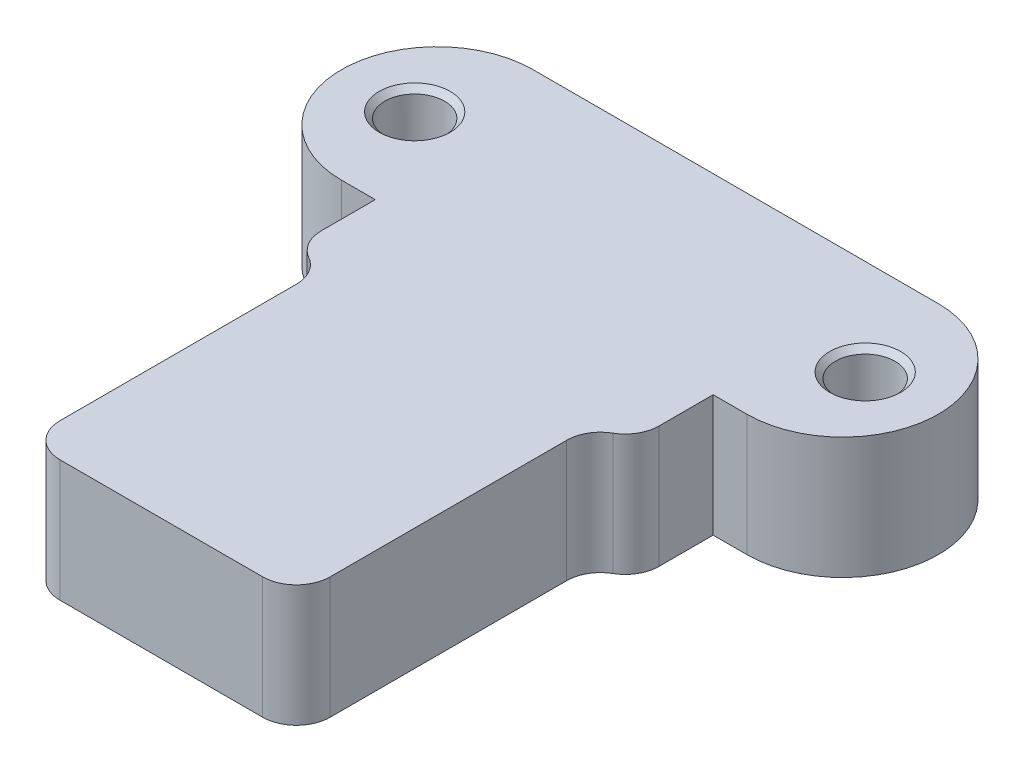
ISO-10303-21;
HEADER;
FILE_DESCRIPTION(('STEP AP214'),'2;1');
FILE_NAME('part.step','',(''),(''),'','','');
FILE_SCHEMA(('AUTOMOTIVE_DESIGN { 1 0 10303 214 1 1 1 1 }'));
ENDSEC;
DATA;
#1=APPLICATION_CONTEXT('core data for automotive mechanical design processes');
#2=APPLICATION_PROTOCOL_DEFINITION('international standard','automotive_design',2000,#1);
#3=PRODUCT_CONTEXT('',#1,'mechanical');
#4=PRODUCT('Part','Part','',(#3));
#5=PRODUCT_RELATED_PRODUCT_CATEGORY('part','',(#4));
#6=PRODUCT_DEFINITION_FORMATION('','',#4);
#7=PRODUCT_DEFINITION_CONTEXT('part definition',#1,'design');
#8=PRODUCT_DEFINITION('design','',#6,#7);
#9=PRODUCT_DEFINITION_SHAPE('','',#8);
#10=(LENGTH_UNIT() NAMED_UNIT(*) SI_UNIT(.MILLI.,.METRE.));
#11=(NAMED_UNIT(*) PLANE_ANGLE_UNIT() SI_UNIT($,.RADIAN.));
#12=(NAMED_UNIT(*) SI_UNIT($,.STERADIAN.) SOLID_ANGLE_UNIT());
#13=UNCERTAINTY_MEASURE_WITH_UNIT(LENGTH_MEASURE(1.E-05),#10,'distance_accuracy_value','');
#14=(GEOMETRIC_REPRESENTATION_CONTEXT(3) GLOBAL_UNCERTAINTY_ASSIGNED_CONTEXT((#13)) GLOBAL_UNIT_ASSIGNED_CONTEXT((#10,
#11,#12)) REPRESENTATION_CONTEXT('',''));
#15=CARTESIAN_POINT('',(0.,0.,0.));
#16=DIRECTION('',(0.,0.,1.));
#17=DIRECTION('',(1.,0.,0.));
#18=AXIS2_PLACEMENT_3D('',#15,#16,#17);
#19=CARTESIAN_POINT('',(-9.,5.4,0.));
#20=DIRECTION('',(0.,1.,0.));
#21=DIRECTION('',(0.,0.,1.));
#22=AXIS2_PLACEMENT_3D('',#19,#20,#21);
#23=PLANE('',#22);
#24=CARTESIAN_POINT('',(10.,5.4,-1.11022302462516E-13));
#25=DIRECTION('',(0.,1.,0.));
#26=DIRECTION('',(0.,0.,1.));
#27=AXIS2_PLACEMENT_3D('',#24,#25,#26);
#28=CIRCLE('',#27,1.57500000000002);
#29=CARTESIAN_POINT('',(10.,5.4,1.57499999999991));
#30=VERTEX_POINT('',#29);
#31=EDGE_CURVE('E198',#30,#30,#28,.F.);
#32=ORIENTED_EDGE('',*,*,#31,.T.);
#33=EDGE_LOOP('',(#32));
#34=FACE_BOUND('',#33,.T.);
#35=CARTESIAN_POINT('',(-10.,5.4,0.));
#36=DIRECTION('',(0.,1.,0.));
#37=DIRECTION('',(0.,0.,1.));
#38=AXIS2_PLACEMENT_3D('',#35,#36,#37);
#39=CIRCLE('',#38,1.57500000000002);
#40=CARTESIAN_POINT('',(-10.,5.4,1.57500000000002));
#41=VERTEX_POINT('',#40);
#42=EDGE_CURVE('E195',#41,#41,#39,.F.);
#43=ORIENTED_EDGE('',*,*,#42,.T.);
#44=EDGE_LOOP('',(#43));
#45=FACE_BOUND('',#44,.T.);
#46=DIRECTION('',(0.,0.,1.));
#47=VECTOR('',#46,1.);
#48=CARTESIAN_POINT('',(-7.50000000000004,5.4,4.25));
#49=LINE('',#48,#47);
#50=CARTESIAN_POINT('',(-7.50000000000004,5.4,4.25));
#51=VERTEX_POINT('',#50);
#52=CARTESIAN_POINT('',(-7.50000000000004,5.4,6.65192378864666));
#53=VERTEX_POINT('',#52);
#54=EDGE_CURVE('E164',#51,#53,#49,.T.);
#55=ORIENTED_EDGE('',*,*,#54,.T.);
#56=CARTESIAN_POINT('',(-6.00000000000004,5.4,6.65192378864666));
#57=DIRECTION('',(0.,1.,0.));
#58=DIRECTION('',(0.,0.,1.));
#59=AXIS2_PLACEMENT_3D('',#56,#57,#58);
#60=CIRCLE('',#59,1.5);
#61=CARTESIAN_POINT('',(-6.75000000000002,5.4,7.95096189432333));
#62=VERTEX_POINT('',#61);
#63=EDGE_CURVE('E249',#53,#62,#60,.T.);
#64=ORIENTED_EDGE('',*,*,#63,.T.);
#65=CARTESIAN_POINT('',(-7.5,5.4,9.25));
#66=DIRECTION('',(0.,1.,0.));
#67=DIRECTION('',(0.,0.,1.));
#68=AXIS2_PLACEMENT_3D('',#65,#66,#67);
#69=CIRCLE('',#68,1.5);
#70=CARTESIAN_POINT('',(-6.,5.4,9.25));
#71=VERTEX_POINT('',#70);
#72=EDGE_CURVE('E233',#62,#71,#69,.F.);
#73=ORIENTED_EDGE('',*,*,#72,.T.);
#74=DIRECTION('',(0.,0.,1.));
#75=VECTOR('',#74,1.);
#76=CARTESIAN_POINT('',(-6.,5.4,7.75));
#77=LINE('',#76,#75);
#78=CARTESIAN_POINT('',(-6.,5.4,19.75));
#79=VERTEX_POINT('',#78);
#80=EDGE_CURVE('E324',#71,#79,#77,.T.);
#81=ORIENTED_EDGE('',*,*,#80,.T.);
#82=CARTESIAN_POINT('',(-4.5,5.4,19.75));
#83=DIRECTION('',(0.,1.,0.));
#84=DIRECTION('',(0.,0.,1.));
#85=AXIS2_PLACEMENT_3D('',#82,#83,#84);
#86=CIRCLE('',#85,1.5);
#87=CARTESIAN_POINT('',(-4.5,5.4,21.25));
#88=VERTEX_POINT('',#87);
#89=EDGE_CURVE('E228',#79,#88,#86,.T.);
#90=ORIENTED_EDGE('',*,*,#89,.T.);
#91=DIRECTION('',(1.,0.,0.));
#92=VECTOR('',#91,1.);
#93=CARTESIAN_POINT('',(-6.,5.4,21.25));
#94=LINE('',#93,#92);
#95=CARTESIAN_POINT('',(4.50000000000013,5.4,21.25));
#96=VERTEX_POINT('',#95);
#97=EDGE_CURVE('E319',#88,#96,#94,.T.);
#98=ORIENTED_EDGE('',*,*,#97,.T.);
#99=CARTESIAN_POINT('',(4.50000000000013,5.4,19.75));
#100=DIRECTION('',(0.,1.,0.));
#101=DIRECTION('',(0.,0.,1.));
#102=AXIS2_PLACEMENT_3D('',#99,#100,#101);
#103=CIRCLE('',#102,1.5);
#104=CARTESIAN_POINT('',(6.00000000000013,5.4,19.75));
#105=VERTEX_POINT('',#104);
#106=EDGE_CURVE('E226',#96,#105,#103,.T.);
#107=ORIENTED_EDGE('',*,*,#106,.T.);
#108=DIRECTION('',(0.,0.,-1.));
#109=VECTOR('',#108,1.);
#110=CARTESIAN_POINT('',(6.00000000000005,5.4,7.75));
#111=LINE('',#110,#109);
#112=CARTESIAN_POINT('',(6.00000000000006,5.4,9.25000000000001));
#113=VERTEX_POINT('',#112);
#114=EDGE_CURVE('E292',#105,#113,#111,.T.);
#115=ORIENTED_EDGE('',*,*,#114,.T.);
#116=CARTESIAN_POINT('',(7.50000000000006,5.4,9.25));
#117=DIRECTION('',(0.,1.,0.));
#118=DIRECTION('',(0.,0.,1.));
#119=AXIS2_PLACEMENT_3D('',#116,#117,#118);
#120=CIRCLE('',#119,1.5);
#121=CARTESIAN_POINT('',(6.75000000000007,5.4,7.95096189432333));
#122=VERTEX_POINT('',#121);
#123=EDGE_CURVE('E237',#113,#122,#120,.F.);
#124=ORIENTED_EDGE('',*,*,#123,.T.);
#125=CARTESIAN_POINT('',(6.00000000000009,5.4,6.65192378864667));
#126=DIRECTION('',(0.,1.,0.));
#127=DIRECTION('',(0.,0.,1.));
#128=AXIS2_PLACEMENT_3D('',#125,#126,#127);
#129=CIRCLE('',#128,1.5);
#130=CARTESIAN_POINT('',(7.50000000000009,5.4,6.65192378864666));
#131=VERTEX_POINT('',#130);
#132=EDGE_CURVE('E56',#122,#131,#129,.T.);
#133=ORIENTED_EDGE('',*,*,#132,.T.);
#134=DIRECTION('',(0.,0.,-1.));
#135=VECTOR('',#134,1.);
#136=CARTESIAN_POINT('',(7.50000000000007,5.4,4.25));
#137=LINE('',#136,#135);
#138=CARTESIAN_POINT('',(7.50000000000007,5.4,4.25));
#139=VERTEX_POINT('',#138);
#140=EDGE_CURVE('E258',#131,#139,#137,.T.);
#141=ORIENTED_EDGE('',*,*,#140,.T.);
#142=DIRECTION('',(1.,0.,0.));
#143=VECTOR('',#142,1.);
#144=CARTESIAN_POINT('',(9.00000000000003,5.4,4.24999999999989));
#145=LINE('',#144,#143);
#146=CARTESIAN_POINT('',(9.00000000000003,5.4,4.24999999999989));
#147=VERTEX_POINT('',#146);
#148=EDGE_CURVE('E287',#139,#147,#145,.T.);
#149=ORIENTED_EDGE('',*,*,#148,.T.);
#150=CARTESIAN_POINT('',(9.,5.4,-1.11022302462516E-13));
#151=DIRECTION('',(0.,1.,0.));
#152=DIRECTION('',(0.,0.,-1.));
#153=AXIS2_PLACEMENT_3D('',#150,#151,#152);
#154=CIRCLE('',#153,4.25);
#155=CARTESIAN_POINT('',(8.99999999999997,5.4,-4.25000000000011));
#156=VERTEX_POINT('',#155);
#157=EDGE_CURVE('E289',#147,#156,#154,.T.);
#158=ORIENTED_EDGE('',*,*,#157,.T.);
#159=DIRECTION('',(-1.,0.,0.));
#160=VECTOR('',#159,1.);
#161=CARTESIAN_POINT('',(-9.,5.4,-4.25));
#162=LINE('',#161,#160);
#163=CARTESIAN_POINT('',(-9.,5.4,-4.25));
#164=VERTEX_POINT('',#163);
#165=EDGE_CURVE('E169',#156,#164,#162,.T.);
#166=ORIENTED_EDGE('',*,*,#165,.T.);
#167=CARTESIAN_POINT('',(-9.,5.4,0.));
#168=DIRECTION('',(0.,1.,0.));
#169=DIRECTION('',(0.,0.,1.));
#170=AXIS2_PLACEMENT_3D('',#167,#168,#169);
#171=CIRCLE('',#170,4.25);
#172=CARTESIAN_POINT('',(-9.,5.4,4.25));
#173=VERTEX_POINT('',#172);
#174=EDGE_CURVE('E165',#164,#173,#171,.T.);
#175=ORIENTED_EDGE('',*,*,#174,.T.);
#176=DIRECTION('',(1.,0.,0.));
#177=VECTOR('',#176,1.);
#178=CARTESIAN_POINT('',(-9.,5.4,4.25));
#179=LINE('',#178,#177);
#180=EDGE_CURVE('E154',#173,#51,#179,.T.);
#181=ORIENTED_EDGE('',*,*,#180,.T.);
#182=EDGE_LOOP('',(#55,#64,#73,#81,#90,#98,#107,#115,#124,#133,#141,#149,#158,#166,#175,#181));
#183=FACE_BOUND('',#182,.T.);
#184=ADVANCED_FACE('F41',(#34,#45,#183),#23,.T.);
#185=CARTESIAN_POINT('',(-9.,0.,0.));
#186=DIRECTION('',(0.,1.,0.));
#187=DIRECTION('',(0.,0.,1.));
#188=AXIS2_PLACEMENT_3D('',#185,#186,#187);
#189=PLANE('',#188);
#190=CARTESIAN_POINT('',(10.,0.,-1.11022302462516E-13));
#191=DIRECTION('',(0.,1.,0.));
#192=DIRECTION('',(0.,0.,1.));
#193=AXIS2_PLACEMENT_3D('',#190,#191,#192);
#194=CIRCLE('',#193,1.57499999999999);
#195=CARTESIAN_POINT('',(10.,0.,1.57499999999988));
#196=VERTEX_POINT('',#195);
#197=EDGE_CURVE('E181',#196,#196,#194,.T.);
#198=ORIENTED_EDGE('',*,*,#197,.T.);
#199=EDGE_LOOP('',(#198));
#200=FACE_BOUND('',#199,.T.);
#201=CARTESIAN_POINT('',(-10.,0.,0.));
#202=DIRECTION('',(0.,1.,0.));
#203=DIRECTION('',(0.,0.,1.));
#204=AXIS2_PLACEMENT_3D('',#201,#202,#203);
#205=CIRCLE('',#204,1.57499999999998);
#206=CARTESIAN_POINT('',(-10.,0.,1.57499999999998));
#207=VERTEX_POINT('',#206);
#208=EDGE_CURVE('E178',#207,#207,#205,.T.);
#209=ORIENTED_EDGE('',*,*,#208,.T.);
#210=EDGE_LOOP('',(#209));
#211=FACE_BOUND('',#210,.T.);
#212=CARTESIAN_POINT('',(-7.5,0.,9.25));
#213=DIRECTION('',(0.,1.,0.));
#214=DIRECTION('',(0.,0.,1.));
#215=AXIS2_PLACEMENT_3D('',#212,#213,#214);
#216=CIRCLE('',#215,1.5);
#217=CARTESIAN_POINT('',(-6.,0.,9.25));
#218=VERTEX_POINT('',#217);
#219=CARTESIAN_POINT('',(-6.75000000000002,0.,7.95096189432333));
#220=VERTEX_POINT('',#219);
#221=EDGE_CURVE('E230',#218,#220,#216,.T.);
#222=ORIENTED_EDGE('',*,*,#221,.T.);
#223=CARTESIAN_POINT('',(-6.00000000000004,0.,6.65192378864666));
#224=DIRECTION('',(0.,1.,0.));
#225=DIRECTION('',(0.,0.,1.));
#226=AXIS2_PLACEMENT_3D('',#223,#224,#225);
#227=CIRCLE('',#226,1.5);
#228=CARTESIAN_POINT('',(-7.50000000000004,0.,6.65192378864666));
#229=VERTEX_POINT('',#228);
#230=EDGE_CURVE('E244',#220,#229,#227,.F.);
#231=ORIENTED_EDGE('',*,*,#230,.T.);
#232=DIRECTION('',(0.,0.,1.));
#233=VECTOR('',#232,1.);
#234=CARTESIAN_POINT('',(-7.50000000000004,0.,4.25));
#235=LINE('',#234,#233);
#236=CARTESIAN_POINT('',(-7.50000000000004,0.,4.25));
#237=VERTEX_POINT('',#236);
#238=EDGE_CURVE('E300',#237,#229,#235,.T.);
#239=ORIENTED_EDGE('',*,*,#238,.F.);
#240=DIRECTION('',(1.,0.,0.));
#241=VECTOR('',#240,1.);
#242=CARTESIAN_POINT('',(-9.,0.,4.25));
#243=LINE('',#242,#241);
#244=CARTESIAN_POINT('',(-9.,0.,4.25));
#245=VERTEX_POINT('',#244);
#246=EDGE_CURVE('E298',#245,#237,#243,.T.);
#247=ORIENTED_EDGE('',*,*,#246,.F.);
#248=CARTESIAN_POINT('',(-9.,0.,0.));
#249=DIRECTION('',(0.,1.,0.));
#250=DIRECTION('',(0.,0.,1.));
#251=AXIS2_PLACEMENT_3D('',#248,#249,#250);
#252=CIRCLE('',#251,4.25);
#253=CARTESIAN_POINT('',(-9.,0.,-4.25));
#254=VERTEX_POINT('',#253);
#255=EDGE_CURVE('E177',#254,#245,#252,.T.);
#256=ORIENTED_EDGE('',*,*,#255,.F.);
#257=DIRECTION('',(-1.,0.,0.));
#258=VECTOR('',#257,1.);
#259=CARTESIAN_POINT('',(-9.,0.,-4.25));
#260=LINE('',#259,#258);
#261=CARTESIAN_POINT('',(8.99999999999997,0.,-4.25000000000011));
#262=VERTEX_POINT('',#261);
#263=EDGE_CURVE('E173',#262,#254,#260,.T.);
#264=ORIENTED_EDGE('',*,*,#263,.F.);
#265=CARTESIAN_POINT('',(9.,0.,-1.11022302462516E-13));
#266=DIRECTION('',(0.,1.,0.));
#267=DIRECTION('',(0.,0.,-1.));
#268=AXIS2_PLACEMENT_3D('',#265,#266,#267);
#269=CIRCLE('',#268,4.25);
#270=CARTESIAN_POINT('',(9.00000000000003,0.,4.24999999999989));
#271=VERTEX_POINT('',#270);
#272=EDGE_CURVE('E267',#271,#262,#269,.T.);
#273=ORIENTED_EDGE('',*,*,#272,.F.);
#274=DIRECTION('',(1.,0.,0.));
#275=VECTOR('',#274,1.);
#276=CARTESIAN_POINT('',(9.00000000000003,0.,4.24999999999989));
#277=LINE('',#276,#275);
#278=CARTESIAN_POINT('',(7.50000000000007,0.,4.25));
#279=VERTEX_POINT('',#278);
#280=EDGE_CURVE('E264',#279,#271,#277,.T.);
#281=ORIENTED_EDGE('',*,*,#280,.F.);
#282=DIRECTION('',(0.,0.,-1.));
#283=VECTOR('',#282,1.);
#284=CARTESIAN_POINT('',(7.50000000000007,0.,4.25));
#285=LINE('',#284,#283);
#286=CARTESIAN_POINT('',(7.50000000000009,0.,6.65192378864666));
#287=VERTEX_POINT('',#286);
#288=EDGE_CURVE('E256',#287,#279,#285,.T.);
#289=ORIENTED_EDGE('',*,*,#288,.F.);
#290=CARTESIAN_POINT('',(6.00000000000009,0.,6.65192378864667));
#291=DIRECTION('',(0.,1.,0.));
#292=DIRECTION('',(0.,0.,1.));
#293=AXIS2_PLACEMENT_3D('',#290,#291,#292);
#294=CIRCLE('',#293,1.5);
#295=CARTESIAN_POINT('',(6.75000000000007,0.,7.95096189432333));
#296=VERTEX_POINT('',#295);
#297=EDGE_CURVE('E242',#287,#296,#294,.F.);
#298=ORIENTED_EDGE('',*,*,#297,.T.);
#299=CARTESIAN_POINT('',(7.50000000000006,0.,9.25));
#300=DIRECTION('',(0.,1.,0.));
#301=DIRECTION('',(0.,0.,1.));
#302=AXIS2_PLACEMENT_3D('',#299,#300,#301);
#303=CIRCLE('',#302,1.5);
#304=CARTESIAN_POINT('',(6.00000000000006,0.,9.25000000000001));
#305=VERTEX_POINT('',#304);
#306=EDGE_CURVE('E235',#296,#305,#303,.T.);
#307=ORIENTED_EDGE('',*,*,#306,.T.);
#308=DIRECTION('',(0.,0.,-1.));
#309=VECTOR('',#308,1.);
#310=CARTESIAN_POINT('',(6.00000000000005,0.,7.75));
#311=LINE('',#310,#309);
#312=CARTESIAN_POINT('',(6.00000000000013,0.,19.75));
#313=VERTEX_POINT('',#312);
#314=EDGE_CURVE('E265',#313,#305,#311,.T.);
#315=ORIENTED_EDGE('',*,*,#314,.F.);
#316=CARTESIAN_POINT('',(4.50000000000013,0.,19.75));
#317=DIRECTION('',(0.,1.,0.));
#318=DIRECTION('',(0.,0.,1.));
#319=AXIS2_PLACEMENT_3D('',#316,#317,#318);
#320=CIRCLE('',#319,1.5);
#321=CARTESIAN_POINT('',(4.50000000000013,0.,21.25));
#322=VERTEX_POINT('',#321);
#323=EDGE_CURVE('E222',#313,#322,#320,.F.);
#324=ORIENTED_EDGE('',*,*,#323,.T.);
#325=DIRECTION('',(1.,0.,0.));
#326=VECTOR('',#325,1.);
#327=CARTESIAN_POINT('',(-6.,0.,21.25));
#328=LINE('',#327,#326);
#329=CARTESIAN_POINT('',(-4.5,0.,21.25));
#330=VERTEX_POINT('',#329);
#331=EDGE_CURVE('E270',#330,#322,#328,.T.);
#332=ORIENTED_EDGE('',*,*,#331,.F.);
#333=CARTESIAN_POINT('',(-4.5,0.,19.75));
#334=DIRECTION('',(0.,1.,0.));
#335=DIRECTION('',(0.,0.,1.));
#336=AXIS2_PLACEMENT_3D('',#333,#334,#335);
#337=CIRCLE('',#336,1.5);
#338=CARTESIAN_POINT('',(-6.,0.,19.75));
#339=VERTEX_POINT('',#338);
#340=EDGE_CURVE('E224',#330,#339,#337,.F.);
#341=ORIENTED_EDGE('',*,*,#340,.T.);
#342=DIRECTION('',(0.,0.,1.));
#343=VECTOR('',#342,1.);
#344=CARTESIAN_POINT('',(-6.,0.,7.75));
#345=LINE('',#344,#343);
#346=EDGE_CURVE('E303',#218,#339,#345,.T.);
#347=ORIENTED_EDGE('',*,*,#346,.F.);
#348=EDGE_LOOP('',(#222,#231,#239,#247,#256,#264,#273,#281,#289,#298,#307,#315,#324,#332,#341,#347));
#349=FACE_BOUND('',#348,.T.);
#350=ADVANCED_FACE('F262',(#200,#211,#349),#189,.F.);
#351=CARTESIAN_POINT('',(-9.,5.4,0.));
#352=DIRECTION('',(0.,-1.,0.));
#353=DIRECTION('',(0.,0.,-1.));
#354=AXIS2_PLACEMENT_3D('',#351,#352,#353);
#355=CYLINDRICAL_SURFACE('',#354,4.25);
#356=ORIENTED_EDGE('',*,*,#255,.T.);
#357=DIRECTION('',(0.,-1.,0.));
#358=VECTOR('',#357,1.);
#359=CARTESIAN_POINT('',(-9.,5.4,4.25));
#360=LINE('',#359,#358);
#361=EDGE_CURVE('E158',#173,#245,#360,.T.);
#362=ORIENTED_EDGE('',*,*,#361,.F.);
#363=ORIENTED_EDGE('',*,*,#174,.F.);
#364=DIRECTION('',(0.,-1.,0.));
#365=VECTOR('',#364,1.);
#366=CARTESIAN_POINT('',(-9.,5.4,-4.25));
#367=LINE('',#366,#365);
#368=EDGE_CURVE('E276',#164,#254,#367,.T.);
#369=ORIENTED_EDGE('',*,*,#368,.T.);
#370=EDGE_LOOP('',(#356,#362,#363,#369));
#371=FACE_BOUND('',#370,.T.);
#372=ADVANCED_FACE('F175',(#371),#355,.T.);
#373=CARTESIAN_POINT('',(-9.,5.4,4.25));
#374=DIRECTION('',(0.,0.,-1.));
#375=DIRECTION('',(-1.,0.,0.));
#376=AXIS2_PLACEMENT_3D('',#373,#374,#375);
#377=PLANE('',#376);
#378=ORIENTED_EDGE('',*,*,#246,.T.);
#379=DIRECTION('',(0.,-1.,0.));
#380=VECTOR('',#379,1.);
#381=CARTESIAN_POINT('',(-7.50000000000004,5.4,4.25));
#382=LINE('',#381,#380);
#383=EDGE_CURVE('E161',#51,#237,#382,.T.);
#384=ORIENTED_EDGE('',*,*,#383,.F.);
#385=ORIENTED_EDGE('',*,*,#180,.F.);
#386=ORIENTED_EDGE('',*,*,#361,.T.);
#387=EDGE_LOOP('',(#378,#384,#385,#386));
#388=FACE_BOUND('',#387,.T.);
#389=ADVANCED_FACE('F156',(#388),#377,.F.);
#390=CARTESIAN_POINT('',(-7.50000000000004,5.4,4.25));
#391=DIRECTION('',(1.,0.,0.));
#392=DIRECTION('',(0.,0.,-1.));
#393=AXIS2_PLACEMENT_3D('',#390,#391,#392);
#394=PLANE('',#393);
#395=ORIENTED_EDGE('',*,*,#238,.T.);
#396=DIRECTION('',(0.,1.,0.));
#397=VECTOR('',#396,1.);
#398=CARTESIAN_POINT('',(-7.50000000000004,5.4,6.65192378864666));
#399=LINE('',#398,#397);
#400=EDGE_CURVE('E246',#229,#53,#399,.T.);
#401=ORIENTED_EDGE('',*,*,#400,.T.);
#402=ORIENTED_EDGE('',*,*,#54,.F.);
#403=ORIENTED_EDGE('',*,*,#383,.T.);
#404=EDGE_LOOP('',(#395,#401,#402,#403));
#405=FACE_BOUND('',#404,.T.);
#406=ADVANCED_FACE('F388',(#405),#394,.F.);
#407=CARTESIAN_POINT('',(-6.,5.4,7.75));
#408=DIRECTION('',(1.,0.,0.));
#409=DIRECTION('',(0.,0.,-1.));
#410=AXIS2_PLACEMENT_3D('',#407,#408,#409);
#411=PLANE('',#410);
#412=ORIENTED_EDGE('',*,*,#80,.F.);
#413=DIRECTION('',(0.,-1.,0.));
#414=VECTOR('',#413,1.);
#415=CARTESIAN_POINT('',(-6.,0.,9.25));
#416=LINE('',#415,#414);
#417=EDGE_CURVE('E209',#71,#218,#416,.T.);
#418=ORIENTED_EDGE('',*,*,#417,.T.);
#419=ORIENTED_EDGE('',*,*,#346,.T.);
#420=DIRECTION('',(0.,-1.,0.));
#421=VECTOR('',#420,1.);
#422=CARTESIAN_POINT('',(-6.,5.4,19.75));
#423=LINE('',#422,#421);
#424=EDGE_CURVE('E207',#339,#79,#423,.F.);
#425=ORIENTED_EDGE('',*,*,#424,.T.);
#426=EDGE_LOOP('',(#412,#418,#419,#425));
#427=FACE_BOUND('',#426,.T.);
#428=ADVANCED_FACE('F344',(#427),#411,.F.);
#429=CARTESIAN_POINT('',(-6.,5.4,21.25));
#430=DIRECTION('',(0.,0.,-1.));
#431=DIRECTION('',(-1.,0.,0.));
#432=AXIS2_PLACEMENT_3D('',#429,#430,#431);
#433=PLANE('',#432);
#434=ORIENTED_EDGE('',*,*,#97,.F.);
#435=DIRECTION('',(0.,-1.,0.));
#436=VECTOR('',#435,1.);
#437=CARTESIAN_POINT('',(-4.5,5.4,21.25));
#438=LINE('',#437,#436);
#439=EDGE_CURVE('E219',#88,#330,#438,.T.);
#440=ORIENTED_EDGE('',*,*,#439,.T.);
#441=ORIENTED_EDGE('',*,*,#331,.T.);
#442=DIRECTION('',(0.,-1.,0.));
#443=VECTOR('',#442,1.);
#444=CARTESIAN_POINT('',(4.50000000000013,5.4,21.25));
#445=LINE('',#444,#443);
#446=EDGE_CURVE('E217',#322,#96,#445,.F.);
#447=ORIENTED_EDGE('',*,*,#446,.T.);
#448=EDGE_LOOP('',(#434,#440,#441,#447));
#449=FACE_BOUND('',#448,.T.);
#450=ADVANCED_FACE('F310',(#449),#433,.F.);
#451=CARTESIAN_POINT('',(6.00000000000005,5.4,7.75));
#452=DIRECTION('',(-1.,0.,0.));
#453=DIRECTION('',(0.,0.,1.));
#454=AXIS2_PLACEMENT_3D('',#451,#452,#453);
#455=PLANE('',#454);
#456=ORIENTED_EDGE('',*,*,#314,.T.);
#457=DIRECTION('',(0.,-1.,0.));
#458=VECTOR('',#457,1.);
#459=CARTESIAN_POINT('',(6.00000000000006,5.4,9.25000000000001));
#460=LINE('',#459,#458);
#461=EDGE_CURVE('E215',#305,#113,#460,.F.);
#462=ORIENTED_EDGE('',*,*,#461,.T.);
#463=ORIENTED_EDGE('',*,*,#114,.F.);
#464=DIRECTION('',(0.,-1.,0.));
#465=VECTOR('',#464,1.);
#466=CARTESIAN_POINT('',(6.00000000000013,5.4,19.75));
#467=LINE('',#466,#465);
#468=EDGE_CURVE('E212',#105,#313,#467,.T.);
#469=ORIENTED_EDGE('',*,*,#468,.T.);
#470=EDGE_LOOP('',(#456,#462,#463,#469));
#471=FACE_BOUND('',#470,.T.);
#472=ADVANCED_FACE('F321',(#471),#455,.F.);
#473=CARTESIAN_POINT('',(7.50000000000007,5.4,4.25));
#474=DIRECTION('',(-1.,0.,0.));
#475=DIRECTION('',(0.,0.,1.));
#476=AXIS2_PLACEMENT_3D('',#473,#474,#475);
#477=PLANE('',#476);
#478=ORIENTED_EDGE('',*,*,#140,.F.);
#479=DIRECTION('',(0.,1.,0.));
#480=VECTOR('',#479,1.);
#481=CARTESIAN_POINT('',(7.50000000000009,5.4,6.65192378864666));
#482=LINE('',#481,#480);
#483=EDGE_CURVE('E49',#131,#287,#482,.F.);
#484=ORIENTED_EDGE('',*,*,#483,.T.);
#485=ORIENTED_EDGE('',*,*,#288,.T.);
#486=DIRECTION('',(0.,-1.,0.));
#487=VECTOR('',#486,1.);
#488=CARTESIAN_POINT('',(7.50000000000007,5.4,4.25));
#489=LINE('',#488,#487);
#490=EDGE_CURVE('E183',#139,#279,#489,.T.);
#491=ORIENTED_EDGE('',*,*,#490,.F.);
#492=EDGE_LOOP('',(#478,#484,#485,#491));
#493=FACE_BOUND('',#492,.T.);
#494=ADVANCED_FACE('F254',(#493),#477,.F.);
#495=CARTESIAN_POINT('',(9.00000000000003,5.4,4.24999999999989));
#496=DIRECTION('',(0.,0.,-1.));
#497=DIRECTION('',(-1.,0.,0.));
#498=AXIS2_PLACEMENT_3D('',#495,#496,#497);
#499=PLANE('',#498);
#500=ORIENTED_EDGE('',*,*,#280,.T.);
#501=DIRECTION('',(0.,-1.,0.));
#502=VECTOR('',#501,1.);
#503=CARTESIAN_POINT('',(9.00000000000003,5.4,4.24999999999989));
#504=LINE('',#503,#502);
#505=EDGE_CURVE('E281',#147,#271,#504,.T.);
#506=ORIENTED_EDGE('',*,*,#505,.F.);
#507=ORIENTED_EDGE('',*,*,#148,.F.);
#508=ORIENTED_EDGE('',*,*,#490,.T.);
#509=EDGE_LOOP('',(#500,#506,#507,#508));
#510=FACE_BOUND('',#509,.T.);
#511=ADVANCED_FACE('F285',(#510),#499,.F.);
#512=CARTESIAN_POINT('',(9.,5.4,-1.11022302462516E-13));
#513=DIRECTION('',(0.,-1.,0.));
#514=DIRECTION('',(0.,0.,-1.));
#515=AXIS2_PLACEMENT_3D('',#512,#513,#514);
#516=CYLINDRICAL_SURFACE('',#515,4.25);
#517=ORIENTED_EDGE('',*,*,#272,.T.);
#518=DIRECTION('',(0.,-1.,0.));
#519=VECTOR('',#518,1.);
#520=CARTESIAN_POINT('',(8.99999999999997,5.4,-4.25000000000011));
#521=LINE('',#520,#519);
#522=EDGE_CURVE('E278',#156,#262,#521,.T.);
#523=ORIENTED_EDGE('',*,*,#522,.F.);
#524=ORIENTED_EDGE('',*,*,#157,.F.);
#525=ORIENTED_EDGE('',*,*,#505,.T.);
#526=EDGE_LOOP('',(#517,#523,#524,#525));
#527=FACE_BOUND('',#526,.T.);
#528=ADVANCED_FACE('F374',(#527),#516,.T.);
#529=CARTESIAN_POINT('',(-9.,5.4,-4.25));
#530=DIRECTION('',(0.,0.,1.));
#531=DIRECTION('',(1.,0.,0.));
#532=AXIS2_PLACEMENT_3D('',#529,#530,#531);
#533=PLANE('',#532);
#534=ORIENTED_EDGE('',*,*,#263,.T.);
#535=ORIENTED_EDGE('',*,*,#368,.F.);
#536=ORIENTED_EDGE('',*,*,#165,.F.);
#537=ORIENTED_EDGE('',*,*,#522,.T.);
#538=EDGE_LOOP('',(#534,#535,#536,#537));
#539=FACE_BOUND('',#538,.T.);
#540=ADVANCED_FACE('F371',(#539),#533,.F.);
#541=CARTESIAN_POINT('',(-10.,5.4,0.));
#542=DIRECTION('',(0.,-1.,0.));
#543=DIRECTION('',(0.,0.,-1.));
#544=AXIS2_PLACEMENT_3D('',#541,#542,#543);
#545=CYLINDRICAL_SURFACE('',#544,1.325);
#546=CARTESIAN_POINT('',(-10.,0.249999999999984,0.));
#547=DIRECTION('',(0.,1.,0.));
#548=DIRECTION('',(0.,0.,1.));
#549=AXIS2_PLACEMENT_3D('',#546,#547,#548);
#550=CIRCLE('',#549,1.325);
#551=CARTESIAN_POINT('',(-10.,0.249999999999984,-1.325));
#552=VERTEX_POINT('',#551);
#553=EDGE_CURVE('E204',#552,#552,#550,.F.);
#554=CARTESIAN_POINT('',(-10.,5.14999999999998,0.));
#555=DIRECTION('',(0.,1.,0.));
#556=DIRECTION('',(0.,0.,1.));
#557=AXIS2_PLACEMENT_3D('',#554,#555,#556);
#558=CIRCLE('',#557,1.325);
#559=CARTESIAN_POINT('',(-10.,5.14999999999998,-1.325));
#560=VERTEX_POINT('',#559);
#561=EDGE_CURVE('E201',#560,#560,#558,.T.);
#562=CARTESIAN_POINT('',(-10.,0.249999999999984,-1.325));
#563=CARTESIAN_POINT('',(-10.,0.30104166666665,-1.325));
#564=CARTESIAN_POINT('',(-10.,0.352083333333317,-1.325));
#565=CARTESIAN_POINT('',(-10.,0.45416666666665,-1.325));
#566=CARTESIAN_POINT('',(-10.,0.505208333333317,-1.325));
#567=CARTESIAN_POINT('',(-10.,0.60729166666665,-1.325));
#568=CARTESIAN_POINT('',(-10.,0.658333333333317,-1.325));
#569=CARTESIAN_POINT('',(-10.,0.76041666666665,-1.325));
#570=CARTESIAN_POINT('',(-10.,0.811458333333317,-1.325));
#571=CARTESIAN_POINT('',(-10.,0.91354166666665,-1.325));
#572=CARTESIAN_POINT('',(-10.,0.964583333333317,-1.325));
#573=CARTESIAN_POINT('',(-10.,1.06666666666665,-1.325));
#574=CARTESIAN_POINT('',(-10.,1.11770833333332,-1.325));
#575=CARTESIAN_POINT('',(-10.,1.21979166666665,-1.325));
#576=CARTESIAN_POINT('',(-10.,1.27083333333332,-1.325));
#577=CARTESIAN_POINT('',(-10.,1.37291666666665,-1.325));
#578=CARTESIAN_POINT('',(-10.,1.42395833333332,-1.325));
#579=CARTESIAN_POINT('',(-10.,1.52604166666665,-1.325));
#580=CARTESIAN_POINT('',(-10.,1.57708333333332,-1.325));
#581=CARTESIAN_POINT('',(-10.,1.67916666666665,-1.325));
#582=CARTESIAN_POINT('',(-10.,1.73020833333332,-1.325));
#583=CARTESIAN_POINT('',(-10.,1.83229166666665,-1.325));
#584=CARTESIAN_POINT('',(-10.,1.88333333333332,-1.325));
#585=CARTESIAN_POINT('',(-10.,1.98541666666665,-1.325));
#586=CARTESIAN_POINT('',(-10.,2.03645833333332,-1.325));
#587=CARTESIAN_POINT('',(-10.,2.13854166666665,-1.325));
#588=CARTESIAN_POINT('',(-10.,2.18958333333332,-1.325));
#589=CARTESIAN_POINT('',(-10.,2.29166666666665,-1.325));
#590=CARTESIAN_POINT('',(-10.,2.34270833333332,-1.325));
#591=CARTESIAN_POINT('',(-10.,2.44479166666665,-1.325));
#592=CARTESIAN_POINT('',(-10.,2.49583333333332,-1.325));
#593=CARTESIAN_POINT('',(-10.,2.59791666666665,-1.325));
#594=CARTESIAN_POINT('',(-10.,2.64895833333332,-1.325));
#595=CARTESIAN_POINT('',(-10.,2.75104166666665,-1.325));
#596=CARTESIAN_POINT('',(-10.,2.80208333333332,-1.325));
#597=CARTESIAN_POINT('',(-10.,2.90416666666665,-1.325));
#598=CARTESIAN_POINT('',(-10.,2.95520833333332,-1.325));
#599=CARTESIAN_POINT('',(-10.,3.05729166666665,-1.325));
#600=CARTESIAN_POINT('',(-10.,3.10833333333332,-1.325));
#601=CARTESIAN_POINT('',(-10.,3.21041666666665,-1.325));
#602=CARTESIAN_POINT('',(-10.,3.26145833333332,-1.325));
#603=CARTESIAN_POINT('',(-10.,3.36354166666665,-1.325));
#604=CARTESIAN_POINT('',(-10.,3.41458333333332,-1.325));
#605=CARTESIAN_POINT('',(-10.,3.51666666666665,-1.325));
#606=CARTESIAN_POINT('',(-10.,3.56770833333331,-1.325));
#607=CARTESIAN_POINT('',(-10.,3.66979166666665,-1.325));
#608=CARTESIAN_POINT('',(-10.,3.72083333333332,-1.325));
#609=CARTESIAN_POINT('',(-10.,3.82291666666665,-1.325));
#610=CARTESIAN_POINT('',(-10.,3.87395833333331,-1.325));
#611=CARTESIAN_POINT('',(-10.,3.97604166666665,-1.325));
#612=CARTESIAN_POINT('',(-10.,4.02708333333331,-1.325));
#613=CARTESIAN_POINT('',(-10.,4.12916666666665,-1.325));
#614=CARTESIAN_POINT('',(-10.,4.18020833333332,-1.325));
#615=CARTESIAN_POINT('',(-10.,4.28229166666665,-1.325));
#616=CARTESIAN_POINT('',(-10.,4.33333333333332,-1.325));
#617=CARTESIAN_POINT('',(-10.,4.43541666666665,-1.325));
#618=CARTESIAN_POINT('',(-10.,4.48645833333331,-1.325));
#619=CARTESIAN_POINT('',(-10.,4.58854166666665,-1.325));
#620=CARTESIAN_POINT('',(-10.,4.63958333333331,-1.325));
#621=CARTESIAN_POINT('',(-10.,4.74166666666665,-1.325));
#622=CARTESIAN_POINT('',(-10.,4.79270833333331,-1.325));
#623=CARTESIAN_POINT('',(-10.,4.89479166666665,-1.325));
#624=CARTESIAN_POINT('',(-10.,4.94583333333331,-1.325));
#625=CARTESIAN_POINT('',(-10.,5.04791666666665,-1.325));
#626=CARTESIAN_POINT('',(-10.,5.09895833333331,-1.325));
#627=CARTESIAN_POINT('',(-10.,5.14999999999998,-1.325));
#628=B_SPLINE_CURVE_WITH_KNOTS('',3,(#562,#563,#564,#565,#566,#567,#568,#569,#570,#571,#572,
#573,#574,#575,#576,#577,#578,#579,#580,#581,#582,#583,#584,#585,#586,#587,#588,#589,#590,#591,
#592,#593,#594,#595,#596,#597,#598,#599,#600,#601,#602,#603,#604,#605,#606,#607,#608,#609,#610,
#611,#612,#613,#614,#615,#616,#617,#618,#619,#620,#621,#622,#623,#624,#625,#626,#627),
.UNSPECIFIED.,.F.,.F.,(4,2,2,2,2,2,2,2,2,2,2,2,2,2,2,2,2,2,2,2,2,2,2,2,2,2,2,2,2,2,2,2,4),(0.,
0.153125,0.30625,0.459375,0.6125,0.765625,0.918749999999999,1.071875,1.225,1.378125,1.53125,
1.684375,1.8375,1.990625,2.14375,2.296875,2.45,2.603125,2.75625,2.909375,3.0625,3.215625,
3.36875,3.521875,3.675,3.828125,3.98125,4.134375,4.2875,4.440625,4.59375,4.746875,4.9),.UNSPECIFIED.);
#629=EDGE_CURVE('BSEAM368',#552,#560,#628,.T.);
#630=ORIENTED_EDGE('',*,*,#553,.T.);
#631=ORIENTED_EDGE('',*,*,#561,.T.);
#632=ORIENTED_EDGE('',*,*,#629,.T.);
#633=ORIENTED_EDGE('',*,*,#629,.F.);
#634=EDGE_LOOP('',(#630,#632,#631,#633));
#635=FACE_BOUND('',#634,.T.);
#636=ADVANCED_FACE('F368',(#635),#545,.F.);
#637=CARTESIAN_POINT('',(10.,5.4,-1.11022302462516E-13));
#638=DIRECTION('',(0.,-1.,0.));
#639=DIRECTION('',(0.,0.,-1.));
#640=AXIS2_PLACEMENT_3D('',#637,#638,#639);
#641=CYLINDRICAL_SURFACE('',#640,1.325);
#642=CARTESIAN_POINT('',(10.,0.249999999999991,-1.11022302462516E-13));
#643=DIRECTION('',(0.,1.,0.));
#644=DIRECTION('',(0.,0.,1.));
#645=AXIS2_PLACEMENT_3D('',#642,#643,#644);
#646=CIRCLE('',#645,1.325);
#647=CARTESIAN_POINT('',(10.,0.249999999999991,-1.32500000000011));
#648=VERTEX_POINT('',#647);
#649=EDGE_CURVE('E192',#648,#648,#646,.F.);
#650=CARTESIAN_POINT('',(10.,5.14999999999999,-1.11022302462516E-13));
#651=DIRECTION('',(0.,1.,0.));
#652=DIRECTION('',(0.,0.,1.));
#653=AXIS2_PLACEMENT_3D('',#650,#651,#652);
#654=CIRCLE('',#653,1.325);
#655=CARTESIAN_POINT('',(10.,5.14999999999999,-1.32500000000011));
#656=VERTEX_POINT('',#655);
#657=EDGE_CURVE('E189',#656,#656,#654,.T.);
#658=CARTESIAN_POINT('',(10.,0.249999999999991,-1.32500000000011));
#659=CARTESIAN_POINT('',(10.,0.301041666666657,-1.32500000000011));
#660=CARTESIAN_POINT('',(10.,0.352083333333324,-1.32500000000011));
#661=CARTESIAN_POINT('',(10.,0.454166666666657,-1.32500000000011));
#662=CARTESIAN_POINT('',(10.,0.505208333333323,-1.32500000000011));
#663=CARTESIAN_POINT('',(10.,0.607291666666657,-1.32500000000011));
#664=CARTESIAN_POINT('',(10.,0.658333333333324,-1.32500000000011));
#665=CARTESIAN_POINT('',(10.,0.760416666666657,-1.32500000000011));
#666=CARTESIAN_POINT('',(10.,0.811458333333323,-1.32500000000011));
#667=CARTESIAN_POINT('',(10.,0.913541666666657,-1.32500000000011));
#668=CARTESIAN_POINT('',(10.,0.964583333333323,-1.32500000000011));
#669=CARTESIAN_POINT('',(10.,1.06666666666666,-1.32500000000011));
#670=CARTESIAN_POINT('',(10.,1.11770833333332,-1.32500000000011));
#671=CARTESIAN_POINT('',(10.,1.21979166666666,-1.32500000000011));
#672=CARTESIAN_POINT('',(10.,1.27083333333332,-1.32500000000011));
#673=CARTESIAN_POINT('',(10.,1.37291666666666,-1.32500000000011));
#674=CARTESIAN_POINT('',(10.,1.42395833333332,-1.32500000000011));
#675=CARTESIAN_POINT('',(10.,1.52604166666666,-1.32500000000011));
#676=CARTESIAN_POINT('',(10.,1.57708333333332,-1.32500000000011));
#677=CARTESIAN_POINT('',(10.,1.67916666666666,-1.32500000000011));
#678=CARTESIAN_POINT('',(10.,1.73020833333332,-1.32500000000011));
#679=CARTESIAN_POINT('',(10.,1.83229166666666,-1.32500000000011));
#680=CARTESIAN_POINT('',(10.,1.88333333333332,-1.32500000000011));
#681=CARTESIAN_POINT('',(10.,1.98541666666666,-1.32500000000011));
#682=CARTESIAN_POINT('',(10.,2.03645833333332,-1.32500000000011));
#683=CARTESIAN_POINT('',(10.,2.13854166666665,-1.32500000000011));
#684=CARTESIAN_POINT('',(10.,2.18958333333332,-1.32500000000011));
#685=CARTESIAN_POINT('',(10.,2.29166666666665,-1.32500000000011));
#686=CARTESIAN_POINT('',(10.,2.34270833333332,-1.32500000000011));
#687=CARTESIAN_POINT('',(10.,2.44479166666665,-1.32500000000011));
#688=CARTESIAN_POINT('',(10.,2.49583333333332,-1.32500000000011));
#689=CARTESIAN_POINT('',(10.,2.59791666666665,-1.32500000000011));
#690=CARTESIAN_POINT('',(10.,2.64895833333332,-1.32500000000011));
#691=CARTESIAN_POINT('',(10.,2.75104166666665,-1.32500000000011));
#692=CARTESIAN_POINT('',(10.,2.80208333333332,-1.32500000000011));
#693=CARTESIAN_POINT('',(10.,2.90416666666665,-1.32500000000011));
#694=CARTESIAN_POINT('',(10.,2.95520833333332,-1.32500000000011));
#695=CARTESIAN_POINT('',(10.,3.05729166666665,-1.32500000000011));
#696=CARTESIAN_POINT('',(10.,3.10833333333332,-1.32500000000011));
#697=CARTESIAN_POINT('',(10.,3.21041666666665,-1.32500000000011));
#698=CARTESIAN_POINT('',(10.,3.26145833333332,-1.32500000000011));
#699=CARTESIAN_POINT('',(10.,3.36354166666665,-1.32500000000011));
#700=CARTESIAN_POINT('',(10.,3.41458333333332,-1.32500000000011));
#701=CARTESIAN_POINT('',(10.,3.51666666666665,-1.32500000000011));
#702=CARTESIAN_POINT('',(10.,3.56770833333332,-1.32500000000011));
#703=CARTESIAN_POINT('',(10.,3.66979166666665,-1.32500000000011));
#704=CARTESIAN_POINT('',(10.,3.72083333333332,-1.32500000000011));
#705=CARTESIAN_POINT('',(10.,3.82291666666665,-1.32500000000011));
#706=CARTESIAN_POINT('',(10.,3.87395833333332,-1.32500000000011));
#707=CARTESIAN_POINT('',(10.,3.97604166666665,-1.32500000000011));
#708=CARTESIAN_POINT('',(10.,4.02708333333332,-1.32500000000011));
#709=CARTESIAN_POINT('',(10.,4.12916666666665,-1.32500000000011));
#710=CARTESIAN_POINT('',(10.,4.18020833333332,-1.32500000000011));
#711=CARTESIAN_POINT('',(10.,4.28229166666665,-1.32500000000011));
#712=CARTESIAN_POINT('',(10.,4.33333333333332,-1.32500000000011));
#713=CARTESIAN_POINT('',(10.,4.43541666666665,-1.32500000000011));
#714=CARTESIAN_POINT('',(10.,4.48645833333332,-1.32500000000011));
#715=CARTESIAN_POINT('',(10.,4.58854166666665,-1.32500000000011));
#716=CARTESIAN_POINT('',(10.,4.63958333333332,-1.32500000000011));
#717=CARTESIAN_POINT('',(10.,4.74166666666665,-1.32500000000011));
#718=CARTESIAN_POINT('',(10.,4.79270833333332,-1.32500000000011));
#719=CARTESIAN_POINT('',(10.,4.89479166666665,-1.32500000000011));
#720=CARTESIAN_POINT('',(10.,4.94583333333332,-1.32500000000011));
#721=CARTESIAN_POINT('',(10.,5.04791666666665,-1.32500000000011));
#722=CARTESIAN_POINT('',(10.,5.09895833333332,-1.32500000000011));
#723=CARTESIAN_POINT('',(10.,5.14999999999998,-1.32500000000011));
#724=B_SPLINE_CURVE_WITH_KNOTS('',3,(#658,#659,#660,#661,#662,#663,#664,#665,#666,#667,#668,
#669,#670,#671,#672,#673,#674,#675,#676,#677,#678,#679,#680,#681,#682,#683,#684,#685,#686,#687,
#688,#689,#690,#691,#692,#693,#694,#695,#696,#697,#698,#699,#700,#701,#702,#703,#704,#705,#706,
#707,#708,#709,#710,#711,#712,#713,#714,#715,#716,#717,#718,#719,#720,#721,#722,#723),
.UNSPECIFIED.,.F.,.F.,(4,2,2,2,2,2,2,2,2,2,2,2,2,2,2,2,2,2,2,2,2,2,2,2,2,2,2,2,2,2,2,2,4),(0.,
0.153125,0.306249999999999,0.459375,0.612499999999999,0.765624999999999,0.918749999999999,
1.071875,1.225,1.378125,1.53125,1.684375,1.8375,1.990625,2.14375,2.296875,2.45,2.603125,2.75625,
2.909375,3.0625,3.215625,3.36875,3.521875,3.67499999999999,3.82812499999999,3.98124999999999,
4.134375,4.28749999999999,4.44062499999999,4.59374999999999,4.74687499999999,4.89999999999999),.UNSPECIFIED.);
#725=EDGE_CURVE('BSEAM403',#648,#656,#724,.T.);
#726=ORIENTED_EDGE('',*,*,#649,.T.);
#727=ORIENTED_EDGE('',*,*,#657,.T.);
#728=ORIENTED_EDGE('',*,*,#725,.T.);
#729=ORIENTED_EDGE('',*,*,#725,.F.);
#730=EDGE_LOOP('',(#726,#728,#727,#729));
#731=FACE_BOUND('',#730,.T.);
#732=ADVANCED_FACE('F403',(#731),#641,.F.);
#733=CARTESIAN_POINT('',(10.,0.,-1.11022302462516E-13));
#734=DIRECTION('',(0.,-1.,0.));
#735=DIRECTION('',(0.,0.,-1.));
#736=AXIS2_PLACEMENT_3D('',#733,#734,#735);
#737=CONICAL_SURFACE('',#736,1.57499999999999,0.785398163397439);
#738=ORIENTED_EDGE('',*,*,#649,.F.);
#739=EDGE_LOOP('',(#738));
#740=FACE_BOUND('',#739,.T.);
#741=ORIENTED_EDGE('',*,*,#197,.F.);
#742=EDGE_LOOP('',(#741));
#743=FACE_BOUND('',#742,.T.);
#744=ADVANCED_FACE('F396',(#740,#743),#737,.F.);
#745=CARTESIAN_POINT('',(10.,5.14999999999999,-1.11022302462516E-13));
#746=DIRECTION('',(0.,1.,0.));
#747=DIRECTION('',(0.,0.,1.));
#748=AXIS2_PLACEMENT_3D('',#745,#746,#747);
#749=CONICAL_SURFACE('',#748,1.325,0.785398163397446);
#750=ORIENTED_EDGE('',*,*,#31,.F.);
#751=EDGE_LOOP('',(#750));
#752=FACE_BOUND('',#751,.T.);
#753=ORIENTED_EDGE('',*,*,#657,.F.);
#754=EDGE_LOOP('',(#753));
#755=FACE_BOUND('',#754,.T.);
#756=ADVANCED_FACE('F402',(#752,#755),#749,.F.);
#757=CARTESIAN_POINT('',(-10.,0.,0.));
#758=DIRECTION('',(0.,-1.,0.));
#759=DIRECTION('',(0.,0.,-1.));
#760=AXIS2_PLACEMENT_3D('',#757,#758,#759);
#761=CONICAL_SURFACE('',#760,1.57499999999998,0.785398163397446);
#762=ORIENTED_EDGE('',*,*,#553,.F.);
#763=EDGE_LOOP('',(#762));
#764=FACE_BOUND('',#763,.T.);
#765=ORIENTED_EDGE('',*,*,#208,.F.);
#766=EDGE_LOOP('',(#765));
#767=FACE_BOUND('',#766,.T.);
#768=ADVANCED_FACE('F410',(#764,#767),#761,.F.);
#769=CARTESIAN_POINT('',(-10.,5.14999999999998,0.));
#770=DIRECTION('',(0.,1.,0.));
#771=DIRECTION('',(0.,0.,1.));
#772=AXIS2_PLACEMENT_3D('',#769,#770,#771);
#773=CONICAL_SURFACE('',#772,1.325,0.785398163397446);
#774=ORIENTED_EDGE('',*,*,#42,.F.);
#775=EDGE_LOOP('',(#774));
#776=FACE_BOUND('',#775,.T.);
#777=ORIENTED_EDGE('',*,*,#561,.F.);
#778=EDGE_LOOP('',(#777));
#779=FACE_BOUND('',#778,.T.);
#780=ADVANCED_FACE('F417',(#776,#779),#773,.F.);
#781=CARTESIAN_POINT('',(-7.5,5.4,9.25));
#782=DIRECTION('',(0.,1.,0.));
#783=DIRECTION('',(0.,0.,1.));
#784=AXIS2_PLACEMENT_3D('',#781,#782,#783);
#785=CYLINDRICAL_SURFACE('',#784,1.5);
#786=ORIENTED_EDGE('',*,*,#72,.F.);
#787=DIRECTION('',(0.,1.,0.));
#788=VECTOR('',#787,1.);
#789=CARTESIAN_POINT('',(-6.75000000000002,5.4,7.95096189432333));
#790=LINE('',#789,#788);
#791=EDGE_CURVE('E239',#62,#220,#790,.F.);
#792=ORIENTED_EDGE('',*,*,#791,.T.);
#793=ORIENTED_EDGE('',*,*,#221,.F.);
#794=ORIENTED_EDGE('',*,*,#417,.F.);
#795=EDGE_LOOP('',(#786,#792,#793,#794));
#796=FACE_BOUND('',#795,.T.);
#797=ADVANCED_FACE('F337',(#796),#785,.F.);
#798=CARTESIAN_POINT('',(7.50000000000006,5.4,9.25));
#799=DIRECTION('',(0.,1.,0.));
#800=DIRECTION('',(0.,0.,1.));
#801=AXIS2_PLACEMENT_3D('',#798,#799,#800);
#802=CYLINDRICAL_SURFACE('',#801,1.5);
#803=ORIENTED_EDGE('',*,*,#306,.F.);
#804=DIRECTION('',(0.,1.,0.));
#805=VECTOR('',#804,1.);
#806=CARTESIAN_POINT('',(6.75000000000007,5.4,7.95096189432333));
#807=LINE('',#806,#805);
#808=EDGE_CURVE('E11',#296,#122,#807,.T.);
#809=ORIENTED_EDGE('',*,*,#808,.T.);
#810=ORIENTED_EDGE('',*,*,#123,.F.);
#811=ORIENTED_EDGE('',*,*,#461,.F.);
#812=EDGE_LOOP('',(#803,#809,#810,#811));
#813=FACE_BOUND('',#812,.T.);
#814=ADVANCED_FACE('F349',(#813),#802,.F.);
#815=CARTESIAN_POINT('',(-4.5,5.4,19.75));
#816=DIRECTION('',(0.,-1.,0.));
#817=DIRECTION('',(0.,0.,-1.));
#818=AXIS2_PLACEMENT_3D('',#815,#816,#817);
#819=CYLINDRICAL_SURFACE('',#818,1.5);
#820=ORIENTED_EDGE('',*,*,#89,.F.);
#821=ORIENTED_EDGE('',*,*,#424,.F.);
#822=ORIENTED_EDGE('',*,*,#340,.F.);
#823=ORIENTED_EDGE('',*,*,#439,.F.);
#824=EDGE_LOOP('',(#820,#821,#822,#823));
#825=FACE_BOUND('',#824,.T.);
#826=ADVANCED_FACE('F347',(#825),#819,.T.);
#827=CARTESIAN_POINT('',(4.50000000000013,5.4,19.75));
#828=DIRECTION('',(0.,-1.,0.));
#829=DIRECTION('',(0.,0.,-1.));
#830=AXIS2_PLACEMENT_3D('',#827,#828,#829);
#831=CYLINDRICAL_SURFACE('',#830,1.5);
#832=ORIENTED_EDGE('',*,*,#106,.F.);
#833=ORIENTED_EDGE('',*,*,#446,.F.);
#834=ORIENTED_EDGE('',*,*,#323,.F.);
#835=ORIENTED_EDGE('',*,*,#468,.F.);
#836=EDGE_LOOP('',(#832,#833,#834,#835));
#837=FACE_BOUND('',#836,.T.);
#838=ADVANCED_FACE('F315',(#837),#831,.T.);
#839=CARTESIAN_POINT('',(-6.00000000000004,5.4,6.65192378864666));
#840=DIRECTION('',(0.,1.,0.));
#841=DIRECTION('',(0.,0.,1.));
#842=AXIS2_PLACEMENT_3D('',#839,#840,#841);
#843=CYLINDRICAL_SURFACE('',#842,1.5);
#844=ORIENTED_EDGE('',*,*,#63,.F.);
#845=ORIENTED_EDGE('',*,*,#400,.F.);
#846=ORIENTED_EDGE('',*,*,#230,.F.);
#847=ORIENTED_EDGE('',*,*,#791,.F.);
#848=EDGE_LOOP('',(#844,#845,#846,#847));
#849=FACE_BOUND('',#848,.T.);
#850=ADVANCED_FACE('F335',(#849),#843,.T.);
#851=CARTESIAN_POINT('',(6.00000000000009,5.4,6.65192378864667));
#852=DIRECTION('',(0.,1.,0.));
#853=DIRECTION('',(0.,0.,1.));
#854=AXIS2_PLACEMENT_3D('',#851,#852,#853);
#855=CYLINDRICAL_SURFACE('',#854,1.5);
#856=ORIENTED_EDGE('',*,*,#132,.F.);
#857=ORIENTED_EDGE('',*,*,#808,.F.);
#858=ORIENTED_EDGE('',*,*,#297,.F.);
#859=ORIENTED_EDGE('',*,*,#483,.F.);
#860=EDGE_LOOP('',(#856,#857,#858,#859));
#861=FACE_BOUND('',#860,.T.);
#862=ADVANCED_FACE('F43',(#861),#855,.T.);
#863=CLOSED_SHELL('',(#184,#350,#372,#389,#406,#428,#450,#472,#494,#511,#528,#540,#636,#732,
#744,#756,#768,#780,#797,#814,#826,#838,#850,#862));
#864=MANIFOLD_SOLID_BREP('B2',#863);
#865=ADVANCED_BREP_SHAPE_REPRESENTATION('',(#18,#864),#14);
#866=SHAPE_DEFINITION_REPRESENTATION(#9,#865);
ENDSEC;
END-ISO-10303-21;
